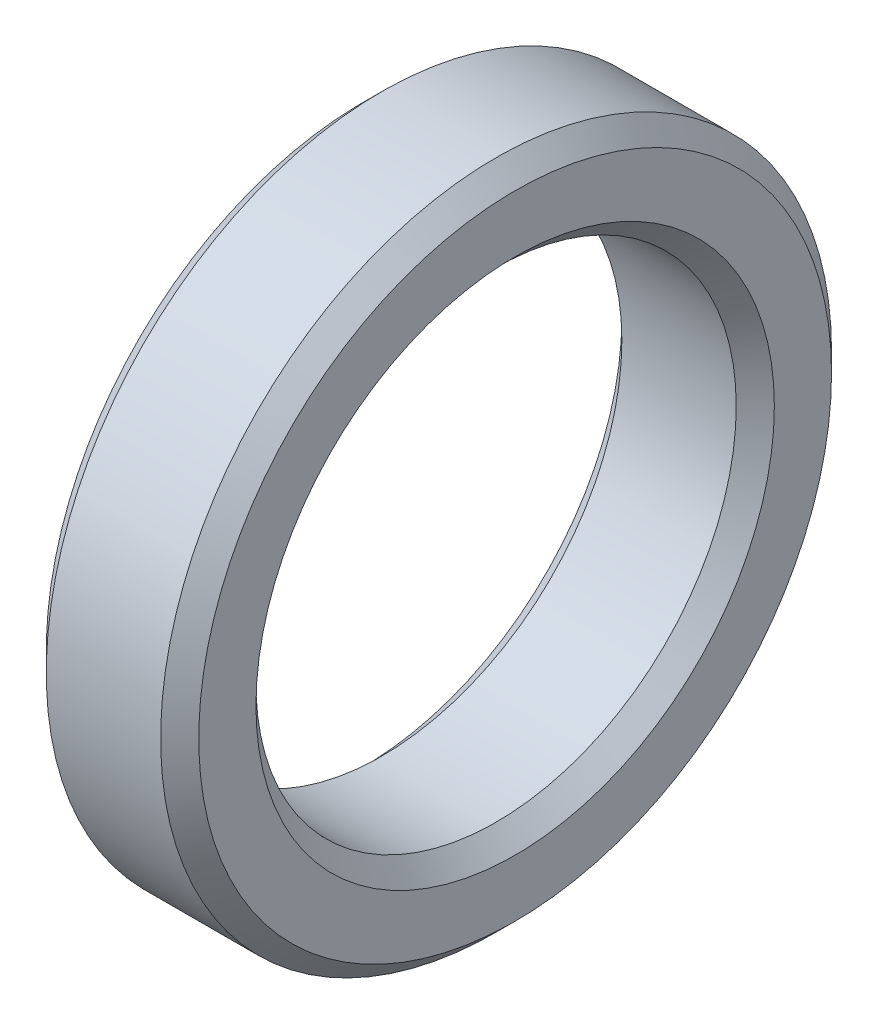
ISO-10303-21;
HEADER;
FILE_DESCRIPTION(('STEP AP214'),'2;1');
FILE_NAME('part.step','',(''),(''),'','','');
FILE_SCHEMA(('AUTOMOTIVE_DESIGN { 1 0 10303 214 1 1 1 1 }'));
ENDSEC;
DATA;
#1=APPLICATION_CONTEXT('core data for automotive mechanical design processes');
#2=APPLICATION_PROTOCOL_DEFINITION('international standard','automotive_design',2000,#1);
#3=PRODUCT_CONTEXT('',#1,'mechanical');
#4=PRODUCT('Part','Part','',(#3));
#5=PRODUCT_RELATED_PRODUCT_CATEGORY('part','',(#4));
#6=PRODUCT_DEFINITION_FORMATION('','',#4);
#7=PRODUCT_DEFINITION_CONTEXT('part definition',#1,'design');
#8=PRODUCT_DEFINITION('design','',#6,#7);
#9=PRODUCT_DEFINITION_SHAPE('','',#8);
#10=(LENGTH_UNIT() NAMED_UNIT(*) SI_UNIT(.MILLI.,.METRE.));
#11=(NAMED_UNIT(*) PLANE_ANGLE_UNIT() SI_UNIT($,.RADIAN.));
#12=(NAMED_UNIT(*) SI_UNIT($,.STERADIAN.) SOLID_ANGLE_UNIT());
#13=UNCERTAINTY_MEASURE_WITH_UNIT(LENGTH_MEASURE(1.E-05),#10,'distance_accuracy_value','');
#14=(GEOMETRIC_REPRESENTATION_CONTEXT(3) GLOBAL_UNCERTAINTY_ASSIGNED_CONTEXT((#13)) GLOBAL_UNIT_ASSIGNED_CONTEXT((#10,
#11,#12)) REPRESENTATION_CONTEXT('',''));
#15=CARTESIAN_POINT('',(0.,0.,0.));
#16=DIRECTION('',(0.,0.,1.));
#17=DIRECTION('',(1.,0.,0.));
#18=AXIS2_PLACEMENT_3D('',#15,#16,#17);
#19=CARTESIAN_POINT('',(4.,0.,0.));
#20=DIRECTION('',(1.,0.,0.));
#21=DIRECTION('',(0.,0.,-1.));
#22=AXIS2_PLACEMENT_3D('',#19,#20,#21);
#23=PLANE('',#22);
#24=CARTESIAN_POINT('',(4.,0.,0.));
#25=DIRECTION('',(1.,0.,0.));
#26=DIRECTION('',(0.,0.,-1.));
#27=AXIS2_PLACEMENT_3D('',#24,#25,#26);
#28=CIRCLE('',#27,6.8);
#29=CARTESIAN_POINT('',(4.,0.,-6.8));
#30=VERTEX_POINT('',#29);
#31=EDGE_CURVE('E10',#30,#30,#28,.F.);
#32=ORIENTED_EDGE('',*,*,#31,.T.);
#33=EDGE_LOOP('',(#32));
#34=FACE_BOUND('',#33,.T.);
#35=CARTESIAN_POINT('',(4.,0.,0.));
#36=DIRECTION('',(1.,0.,0.));
#37=DIRECTION('',(0.,0.,-1.));
#38=AXIS2_PLACEMENT_3D('',#35,#36,#37);
#39=CIRCLE('',#38,8.3);
#40=CARTESIAN_POINT('',(4.,0.,-8.3));
#41=VERTEX_POINT('',#40);
#42=EDGE_CURVE('E57',#41,#41,#39,.T.);
#43=ORIENTED_EDGE('',*,*,#42,.T.);
#44=EDGE_LOOP('',(#43));
#45=FACE_BOUND('',#44,.T.);
#46=ADVANCED_FACE('F36',(#34,#45),#23,.T.);
#47=CARTESIAN_POINT('',(0.,0.,0.));
#48=DIRECTION('',(1.,0.,0.));
#49=DIRECTION('',(0.,0.,-1.));
#50=AXIS2_PLACEMENT_3D('',#47,#48,#49);
#51=PLANE('',#50);
#52=CARTESIAN_POINT('',(0.,0.,0.));
#53=DIRECTION('',(1.,0.,0.));
#54=DIRECTION('',(0.,0.,-1.));
#55=AXIS2_PLACEMENT_3D('',#52,#53,#54);
#56=CIRCLE('',#55,6.8);
#57=CARTESIAN_POINT('',(0.,0.,-6.8));
#58=VERTEX_POINT('',#57);
#59=EDGE_CURVE('E52',#58,#58,#56,.T.);
#60=ORIENTED_EDGE('',*,*,#59,.T.);
#61=EDGE_LOOP('',(#60));
#62=FACE_BOUND('',#61,.T.);
#63=CARTESIAN_POINT('',(0.,0.,0.));
#64=DIRECTION('',(1.,0.,0.));
#65=DIRECTION('',(0.,0.,-1.));
#66=AXIS2_PLACEMENT_3D('',#63,#64,#65);
#67=CIRCLE('',#66,8.3);
#68=CARTESIAN_POINT('',(0.,0.,-8.3));
#69=VERTEX_POINT('',#68);
#70=EDGE_CURVE('E60',#69,#69,#67,.F.);
#71=ORIENTED_EDGE('',*,*,#70,.T.);
#72=EDGE_LOOP('',(#71));
#73=FACE_BOUND('',#72,.T.);
#74=ADVANCED_FACE('F81',(#62,#73),#51,.F.);
#75=CARTESIAN_POINT('',(4.,0.,0.));
#76=DIRECTION('',(-1.,0.,0.));
#77=DIRECTION('',(0.,0.,1.));
#78=AXIS2_PLACEMENT_3D('',#75,#76,#77);
#79=CYLINDRICAL_SURFACE('',#78,8.8);
#80=CARTESIAN_POINT('',(0.500000000000002,0.,0.));
#81=DIRECTION('',(1.,0.,0.));
#82=DIRECTION('',(0.,0.,-1.));
#83=AXIS2_PLACEMENT_3D('',#80,#81,#82);
#84=CIRCLE('',#83,8.8);
#85=CARTESIAN_POINT('',(0.500000000000002,0.,-8.8));
#86=VERTEX_POINT('',#85);
#87=EDGE_CURVE('E63',#86,#86,#84,.T.);
#88=ORIENTED_EDGE('',*,*,#87,.T.);
#89=EDGE_LOOP('',(#88));
#90=FACE_BOUND('',#89,.T.);
#91=CARTESIAN_POINT('',(3.49999999999999,0.,0.));
#92=DIRECTION('',(1.,0.,0.));
#93=DIRECTION('',(0.,0.,-1.));
#94=AXIS2_PLACEMENT_3D('',#91,#92,#93);
#95=CIRCLE('',#94,8.8);
#96=CARTESIAN_POINT('',(3.49999999999999,0.,-8.8));
#97=VERTEX_POINT('',#96);
#98=EDGE_CURVE('E66',#97,#97,#95,.F.);
#99=ORIENTED_EDGE('',*,*,#98,.T.);
#100=EDGE_LOOP('',(#99));
#101=FACE_BOUND('',#100,.T.);
#102=ADVANCED_FACE('F70',(#90,#101),#79,.T.);
#103=CARTESIAN_POINT('',(4.,0.,0.));
#104=DIRECTION('',(-1.,0.,0.));
#105=DIRECTION('',(0.,0.,1.));
#106=AXIS2_PLACEMENT_3D('',#103,#104,#105);
#107=CYLINDRICAL_SURFACE('',#106,6.3);
#108=CARTESIAN_POINT('',(0.5,0.,0.));
#109=DIRECTION('',(1.,0.,0.));
#110=DIRECTION('',(0.,0.,-1.));
#111=AXIS2_PLACEMENT_3D('',#108,#109,#110);
#112=CIRCLE('',#111,6.3);
#113=CARTESIAN_POINT('',(0.5,0.,-6.3));
#114=VERTEX_POINT('',#113);
#115=EDGE_CURVE('E44',#114,#114,#112,.F.);
#116=ORIENTED_EDGE('',*,*,#115,.T.);
#117=EDGE_LOOP('',(#116));
#118=FACE_BOUND('',#117,.T.);
#119=CARTESIAN_POINT('',(3.5,0.,0.));
#120=DIRECTION('',(1.,0.,0.));
#121=DIRECTION('',(0.,0.,-1.));
#122=AXIS2_PLACEMENT_3D('',#119,#120,#121);
#123=CIRCLE('',#122,6.3);
#124=CARTESIAN_POINT('',(3.5,0.,-6.3));
#125=VERTEX_POINT('',#124);
#126=EDGE_CURVE('E48',#125,#125,#123,.T.);
#127=ORIENTED_EDGE('',*,*,#126,.T.);
#128=EDGE_LOOP('',(#127));
#129=FACE_BOUND('',#128,.T.);
#130=ADVANCED_FACE('F89',(#118,#129),#107,.F.);
#131=CARTESIAN_POINT('',(0.500000000000002,0.,0.));
#132=DIRECTION('',(1.,0.,0.));
#133=DIRECTION('',(0.,0.,-1.));
#134=AXIS2_PLACEMENT_3D('',#131,#132,#133);
#135=CONICAL_SURFACE('',#134,8.8,0.785398163397448);
#136=ORIENTED_EDGE('',*,*,#70,.F.);
#137=EDGE_LOOP('',(#136));
#138=FACE_BOUND('',#137,.T.);
#139=ORIENTED_EDGE('',*,*,#87,.F.);
#140=EDGE_LOOP('',(#139));
#141=FACE_BOUND('',#140,.T.);
#142=ADVANCED_FACE('F76',(#138,#141),#135,.T.);
#143=CARTESIAN_POINT('',(4.,0.,0.));
#144=DIRECTION('',(-1.,0.,0.));
#145=DIRECTION('',(0.,0.,1.));
#146=AXIS2_PLACEMENT_3D('',#143,#144,#145);
#147=CONICAL_SURFACE('',#146,8.3,0.785398163397445);
#148=ORIENTED_EDGE('',*,*,#98,.F.);
#149=EDGE_LOOP('',(#148));
#150=FACE_BOUND('',#149,.T.);
#151=ORIENTED_EDGE('',*,*,#42,.F.);
#152=EDGE_LOOP('',(#151));
#153=FACE_BOUND('',#152,.T.);
#154=ADVANCED_FACE('F72',(#150,#153),#147,.T.);
#155=CARTESIAN_POINT('',(0.,0.,0.));
#156=DIRECTION('',(-1.,0.,0.));
#157=DIRECTION('',(0.,0.,1.));
#158=AXIS2_PLACEMENT_3D('',#155,#156,#157);
#159=CONICAL_SURFACE('',#158,6.8,0.785398163397444);
#160=ORIENTED_EDGE('',*,*,#115,.F.);
#161=EDGE_LOOP('',(#160));
#162=FACE_BOUND('',#161,.T.);
#163=ORIENTED_EDGE('',*,*,#59,.F.);
#164=EDGE_LOOP('',(#163));
#165=FACE_BOUND('',#164,.T.);
#166=ADVANCED_FACE('F75',(#162,#165),#159,.F.);
#167=CARTESIAN_POINT('',(3.5,0.,0.));
#168=DIRECTION('',(1.,0.,0.));
#169=DIRECTION('',(0.,0.,-1.));
#170=AXIS2_PLACEMENT_3D('',#167,#168,#169);
#171=CONICAL_SURFACE('',#170,6.3,0.785398163397454);
#172=ORIENTED_EDGE('',*,*,#31,.F.);
#173=EDGE_LOOP('',(#172));
#174=FACE_BOUND('',#173,.T.);
#175=ORIENTED_EDGE('',*,*,#126,.F.);
#176=EDGE_LOOP('',(#175));
#177=FACE_BOUND('',#176,.T.);
#178=ADVANCED_FACE('F39',(#174,#177),#171,.F.);
#179=CLOSED_SHELL('',(#46,#74,#102,#130,#142,#154,#166,#178));
#180=MANIFOLD_SOLID_BREP('B2',#179);
#181=ADVANCED_BREP_SHAPE_REPRESENTATION('',(#18,#180),#14);
#182=SHAPE_DEFINITION_REPRESENTATION(#9,#181);
ENDSEC;
END-ISO-10303-21;
